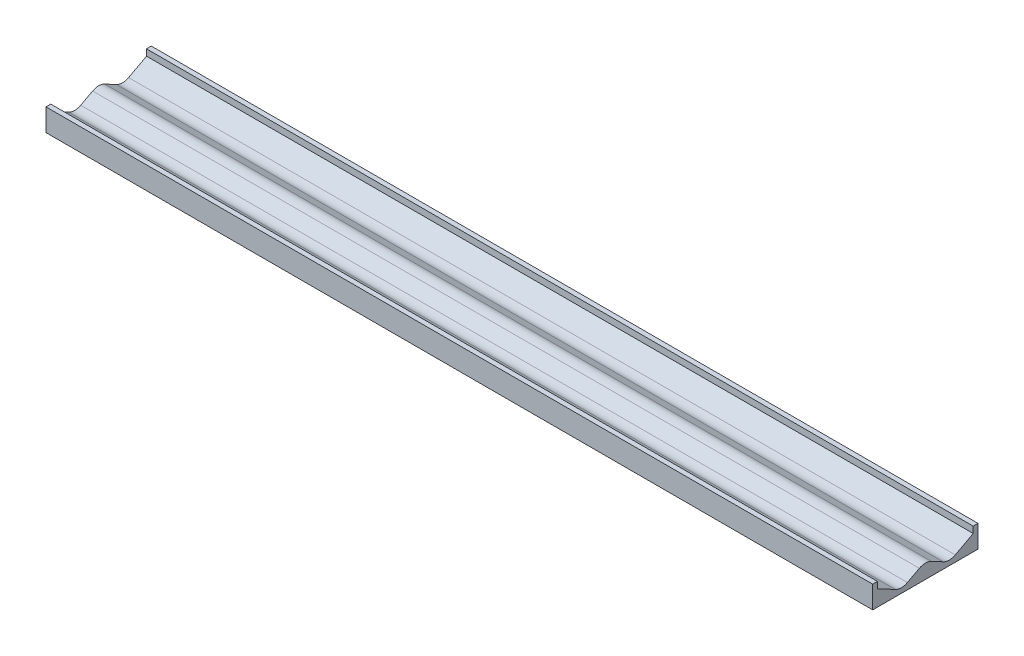
ISO-10303-21;
HEADER;
FILE_DESCRIPTION(('STEP AP214'),'2;1');
FILE_NAME('part.step','',(''),(''),'','','');
FILE_SCHEMA(('AUTOMOTIVE_DESIGN { 1 0 10303 214 1 1 1 1 }'));
ENDSEC;
DATA;
#1=APPLICATION_CONTEXT('core data for automotive mechanical design processes');
#2=APPLICATION_PROTOCOL_DEFINITION('international standard','automotive_design',2000,#1);
#3=PRODUCT_CONTEXT('',#1,'mechanical');
#4=PRODUCT('Part','Part','',(#3));
#5=PRODUCT_RELATED_PRODUCT_CATEGORY('part','',(#4));
#6=PRODUCT_DEFINITION_FORMATION('','',#4);
#7=PRODUCT_DEFINITION_CONTEXT('part definition',#1,'design');
#8=PRODUCT_DEFINITION('design','',#6,#7);
#9=PRODUCT_DEFINITION_SHAPE('','',#8);
#10=(LENGTH_UNIT() NAMED_UNIT(*) SI_UNIT(.MILLI.,.METRE.));
#11=(NAMED_UNIT(*) PLANE_ANGLE_UNIT() SI_UNIT($,.RADIAN.));
#12=(NAMED_UNIT(*) SI_UNIT($,.STERADIAN.) SOLID_ANGLE_UNIT());
#13=UNCERTAINTY_MEASURE_WITH_UNIT(LENGTH_MEASURE(1.E-05),#10,'distance_accuracy_value','');
#14=(GEOMETRIC_REPRESENTATION_CONTEXT(3) GLOBAL_UNCERTAINTY_ASSIGNED_CONTEXT((#13)) GLOBAL_UNIT_ASSIGNED_CONTEXT((#10,
#11,#12)) REPRESENTATION_CONTEXT('',''));
#15=CARTESIAN_POINT('',(0.,0.,0.));
#16=DIRECTION('',(0.,0.,1.));
#17=DIRECTION('',(1.,0.,0.));
#18=AXIS2_PLACEMENT_3D('',#15,#16,#17);
#19=CARTESIAN_POINT('',(0.,7.,0.));
#20=DIRECTION('',(0.,-1.,0.));
#21=DIRECTION('',(0.,0.,-1.));
#22=AXIS2_PLACEMENT_3D('',#19,#20,#21);
#23=PLANE('',#22);
#24=DIRECTION('',(0.,0.,-1.));
#25=VECTOR('',#24,1.);
#26=CARTESIAN_POINT('',(129.525,7.,16.5));
#27=LINE('',#26,#25);
#28=CARTESIAN_POINT('',(129.525,7.,16.5));
#29=VERTEX_POINT('',#28);
#30=CARTESIAN_POINT('',(129.525,7.,15.));
#31=VERTEX_POINT('',#30);
#32=EDGE_CURVE('E211',#29,#31,#27,.T.);
#33=ORIENTED_EDGE('',*,*,#32,.T.);
#34=DIRECTION('',(-1.,0.,0.));
#35=VECTOR('',#34,1.);
#36=CARTESIAN_POINT('',(0.,7.,15.));
#37=LINE('',#36,#35);
#38=CARTESIAN_POINT('',(-129.525,7.,15.));
#39=VERTEX_POINT('',#38);
#40=EDGE_CURVE('E239',#31,#39,#37,.T.);
#41=ORIENTED_EDGE('',*,*,#40,.T.);
#42=DIRECTION('',(0.,0.,1.));
#43=VECTOR('',#42,1.);
#44=CARTESIAN_POINT('',(-129.525,7.,16.5));
#45=LINE('',#44,#43);
#46=CARTESIAN_POINT('',(-129.525,7.,16.5));
#47=VERTEX_POINT('',#46);
#48=EDGE_CURVE('E215',#39,#47,#45,.T.);
#49=ORIENTED_EDGE('',*,*,#48,.T.);
#50=DIRECTION('',(1.,0.,0.));
#51=VECTOR('',#50,1.);
#52=CARTESIAN_POINT('',(-129.525,7.,16.5));
#53=LINE('',#52,#51);
#54=EDGE_CURVE('E57',#47,#29,#53,.T.);
#55=ORIENTED_EDGE('',*,*,#54,.T.);
#56=EDGE_LOOP('',(#33,#41,#49,#55));
#57=FACE_BOUND('',#56,.T.);
#58=ADVANCED_FACE('F33',(#57),#23,.F.);
#59=CARTESIAN_POINT('',(129.525,7.,16.5));
#60=DIRECTION('',(-1.,0.,0.));
#61=DIRECTION('',(0.,0.,1.));
#62=AXIS2_PLACEMENT_3D('',#59,#60,#61);
#63=PLANE('',#62);
#64=CARTESIAN_POINT('',(129.525,5.53333333333333,7.5));
#65=DIRECTION('',(1.,0.,0.));
#66=DIRECTION('',(0.,0.,1.));
#67=AXIS2_PLACEMENT_3D('',#64,#65,#66);
#68=CIRCLE('',#67,4.);
#69=CARTESIAN_POINT('',(129.525,2.00392156862746,9.38235294117648));
#70=VERTEX_POINT('',#69);
#71=CARTESIAN_POINT('',(129.525,2.00392156862746,5.61764705882351));
#72=VERTEX_POINT('',#71);
#73=EDGE_CURVE('E150',#70,#72,#68,.T.);
#74=ORIENTED_EDGE('',*,*,#73,.F.);
#75=DIRECTION('',(0.,-0.470588235294118,-0.88235294117647));
#76=VECTOR('',#75,1.);
#77=CARTESIAN_POINT('',(129.525,5.,15.));
#78=LINE('',#77,#76);
#79=CARTESIAN_POINT('',(129.525,5.,15.));
#80=VERTEX_POINT('',#79);
#81=EDGE_CURVE('E160',#80,#70,#78,.T.);
#82=ORIENTED_EDGE('',*,*,#81,.F.);
#83=DIRECTION('',(0.,-1.,0.));
#84=VECTOR('',#83,1.);
#85=CARTESIAN_POINT('',(129.525,7.,15.));
#86=LINE('',#85,#84);
#87=EDGE_CURVE('E199',#31,#80,#86,.T.);
#88=ORIENTED_EDGE('',*,*,#87,.F.);
#89=ORIENTED_EDGE('',*,*,#32,.F.);
#90=DIRECTION('',(0.,-1.,0.));
#91=VECTOR('',#90,1.);
#92=CARTESIAN_POINT('',(129.525,7.,16.5));
#93=LINE('',#92,#91);
#94=CARTESIAN_POINT('',(129.525,0.,16.5));
#95=VERTEX_POINT('',#94);
#96=EDGE_CURVE('E220',#29,#95,#93,.T.);
#97=ORIENTED_EDGE('',*,*,#96,.T.);
#98=DIRECTION('',(0.,0.,-1.));
#99=VECTOR('',#98,1.);
#100=CARTESIAN_POINT('',(129.525,0.,16.5));
#101=LINE('',#100,#99);
#102=CARTESIAN_POINT('',(129.525,0.,-16.5));
#103=VERTEX_POINT('',#102);
#104=EDGE_CURVE('E210',#95,#103,#101,.T.);
#105=ORIENTED_EDGE('',*,*,#104,.T.);
#106=DIRECTION('',(0.,-1.,0.));
#107=VECTOR('',#106,1.);
#108=CARTESIAN_POINT('',(129.525,7.,-16.5));
#109=LINE('',#108,#107);
#110=CARTESIAN_POINT('',(129.525,7.,-16.5));
#111=VERTEX_POINT('',#110);
#112=EDGE_CURVE('E234',#111,#103,#109,.T.);
#113=ORIENTED_EDGE('',*,*,#112,.F.);
#114=CARTESIAN_POINT('',(129.525,7.,-15.));
#115=VERTEX_POINT('',#114);
#116=EDGE_CURVE('E85',#115,#111,#27,.T.);
#117=ORIENTED_EDGE('',*,*,#116,.F.);
#118=DIRECTION('',(0.,1.,0.));
#119=VECTOR('',#118,1.);
#120=CARTESIAN_POINT('',(129.525,5.,-15.));
#121=LINE('',#120,#119);
#122=CARTESIAN_POINT('',(129.525,5.,-15.));
#123=VERTEX_POINT('',#122);
#124=EDGE_CURVE('E48',#123,#115,#121,.T.);
#125=ORIENTED_EDGE('',*,*,#124,.F.);
#126=DIRECTION('',(0.,0.470588235294117,-0.882352941176471));
#127=VECTOR('',#126,1.);
#128=CARTESIAN_POINT('',(129.525,2.00392156862746,-9.38235294117648));
#129=LINE('',#128,#127);
#130=CARTESIAN_POINT('',(129.525,2.00392156862746,-9.38235294117648));
#131=VERTEX_POINT('',#130);
#132=EDGE_CURVE('E157',#131,#123,#129,.T.);
#133=ORIENTED_EDGE('',*,*,#132,.F.);
#134=CARTESIAN_POINT('',(129.525,5.53333333333333,-7.5));
#135=DIRECTION('',(1.,0.,0.));
#136=DIRECTION('',(0.,0.,1.));
#137=AXIS2_PLACEMENT_3D('',#134,#135,#136);
#138=CIRCLE('',#137,4.);
#139=CARTESIAN_POINT('',(129.525,2.00392156862746,-5.61764705882351));
#140=VERTEX_POINT('',#139);
#141=EDGE_CURVE('E180',#140,#131,#138,.T.);
#142=ORIENTED_EDGE('',*,*,#141,.F.);
#143=DIRECTION('',(0.,-0.470588235294118,-0.88235294117647));
#144=VECTOR('',#143,1.);
#145=CARTESIAN_POINT('',(129.525,3.99607843137254,-1.88235294117649));
#146=LINE('',#145,#144);
#147=CARTESIAN_POINT('',(129.525,3.99607843137254,-1.88235294117649));
#148=VERTEX_POINT('',#147);
#149=EDGE_CURVE('E177',#148,#140,#146,.T.);
#150=ORIENTED_EDGE('',*,*,#149,.F.);
#151=CARTESIAN_POINT('',(129.525,0.466666666666666,0.));
#152=DIRECTION('',(-1.,0.,0.));
#153=DIRECTION('',(0.,0.,-1.));
#154=AXIS2_PLACEMENT_3D('',#151,#152,#153);
#155=CIRCLE('',#154,4.);
#156=CARTESIAN_POINT('',(129.525,3.99607843137254,1.88235294117648));
#157=VERTEX_POINT('',#156);
#158=EDGE_CURVE('E172',#157,#148,#155,.T.);
#159=ORIENTED_EDGE('',*,*,#158,.F.);
#160=DIRECTION('',(0.,0.470588235294118,-0.88235294117647));
#161=VECTOR('',#160,1.);
#162=CARTESIAN_POINT('',(129.525,2.00392156862746,5.61764705882351));
#163=LINE('',#162,#161);
#164=EDGE_CURVE('E170',#72,#157,#163,.T.);
#165=ORIENTED_EDGE('',*,*,#164,.F.);
#166=EDGE_LOOP('',(#74,#82,#88,#89,#97,#105,#113,#117,#125,#133,#142,#150,#159,#165));
#167=FACE_BOUND('',#166,.T.);
#168=ADVANCED_FACE('F35',(#167),#63,.F.);
#169=CARTESIAN_POINT('',(-129.525,7.,-16.5));
#170=DIRECTION('',(0.,0.,1.));
#171=DIRECTION('',(1.,0.,0.));
#172=AXIS2_PLACEMENT_3D('',#169,#170,#171);
#173=PLANE('',#172);
#174=DIRECTION('',(-1.,0.,0.));
#175=VECTOR('',#174,1.);
#176=CARTESIAN_POINT('',(-129.525,0.,-16.5));
#177=LINE('',#176,#175);
#178=CARTESIAN_POINT('',(-129.525,0.,-16.5));
#179=VERTEX_POINT('',#178);
#180=EDGE_CURVE('E223',#103,#179,#177,.T.);
#181=ORIENTED_EDGE('',*,*,#180,.T.);
#182=DIRECTION('',(0.,-1.,0.));
#183=VECTOR('',#182,1.);
#184=CARTESIAN_POINT('',(-129.525,7.,-16.5));
#185=LINE('',#184,#183);
#186=CARTESIAN_POINT('',(-129.525,7.,-16.5));
#187=VERTEX_POINT('',#186);
#188=EDGE_CURVE('E231',#187,#179,#185,.T.);
#189=ORIENTED_EDGE('',*,*,#188,.F.);
#190=DIRECTION('',(-1.,0.,0.));
#191=VECTOR('',#190,1.);
#192=CARTESIAN_POINT('',(-129.525,7.,-16.5));
#193=LINE('',#192,#191);
#194=EDGE_CURVE('E213',#111,#187,#193,.T.);
#195=ORIENTED_EDGE('',*,*,#194,.F.);
#196=ORIENTED_EDGE('',*,*,#112,.T.);
#197=EDGE_LOOP('',(#181,#189,#195,#196));
#198=FACE_BOUND('',#197,.T.);
#199=ADVANCED_FACE('F273',(#198),#173,.F.);
#200=CARTESIAN_POINT('',(-129.525,7.,16.5));
#201=DIRECTION('',(1.,0.,0.));
#202=DIRECTION('',(0.,0.,-1.));
#203=AXIS2_PLACEMENT_3D('',#200,#201,#202);
#204=PLANE('',#203);
#205=DIRECTION('',(0.,-1.,0.));
#206=VECTOR('',#205,1.);
#207=CARTESIAN_POINT('',(-129.525,7.,15.));
#208=LINE('',#207,#206);
#209=CARTESIAN_POINT('',(-129.525,5.,15.));
#210=VERTEX_POINT('',#209);
#211=EDGE_CURVE('E207',#39,#210,#208,.T.);
#212=ORIENTED_EDGE('',*,*,#211,.T.);
#213=DIRECTION('',(0.,-0.470588235294118,-0.882352941176471));
#214=VECTOR('',#213,1.);
#215=CARTESIAN_POINT('',(-129.525,6.06574394463668,16.9982698961938));
#216=LINE('',#215,#214);
#217=CARTESIAN_POINT('',(-129.525,2.00392156862746,9.38235294117648));
#218=VERTEX_POINT('',#217);
#219=EDGE_CURVE('E196',#210,#218,#216,.T.);
#220=ORIENTED_EDGE('',*,*,#219,.T.);
#221=CARTESIAN_POINT('',(-129.525,5.53333333333333,7.5));
#222=DIRECTION('',(1.,0.,0.));
#223=DIRECTION('',(0.,0.,-1.));
#224=AXIS2_PLACEMENT_3D('',#221,#222,#223);
#225=CIRCLE('',#224,4.);
#226=CARTESIAN_POINT('',(-129.525,2.00392156862746,5.61764705882351));
#227=VERTEX_POINT('',#226);
#228=EDGE_CURVE('E153',#218,#227,#225,.T.);
#229=ORIENTED_EDGE('',*,*,#228,.T.);
#230=DIRECTION('',(0.,0.470588235294117,-0.882352941176471));
#231=VECTOR('',#230,1.);
#232=CARTESIAN_POINT('',(-129.525,-1.40830449826989,12.0155709342561));
#233=LINE('',#232,#231);
#234=CARTESIAN_POINT('',(-129.525,3.99607843137254,1.88235294117648));
#235=VERTEX_POINT('',#234);
#236=EDGE_CURVE('E243',#227,#235,#233,.T.);
#237=ORIENTED_EDGE('',*,*,#236,.T.);
#238=CARTESIAN_POINT('',(-129.525,0.466666666666666,0.));
#239=DIRECTION('',(1.,0.,0.));
#240=DIRECTION('',(0.,0.,-1.));
#241=AXIS2_PLACEMENT_3D('',#238,#239,#240);
#242=CIRCLE('',#241,4.);
#243=CARTESIAN_POINT('',(-129.525,3.99607843137254,-1.88235294117649));
#244=VERTEX_POINT('',#243);
#245=EDGE_CURVE('E246',#235,#244,#242,.F.);
#246=ORIENTED_EDGE('',*,*,#245,.T.);
#247=DIRECTION('',(0.,-0.470588235294118,-0.882352941176471));
#248=VECTOR('',#247,1.);
#249=CARTESIAN_POINT('',(-129.525,12.2941176470588,13.6764705882353));
#250=LINE('',#249,#248);
#251=CARTESIAN_POINT('',(-129.525,2.00392156862746,-5.61764705882351));
#252=VERTEX_POINT('',#251);
#253=EDGE_CURVE('E41',#244,#252,#250,.T.);
#254=ORIENTED_EDGE('',*,*,#253,.T.);
#255=CARTESIAN_POINT('',(-129.525,5.53333333333333,-7.5));
#256=DIRECTION('',(1.,0.,0.));
#257=DIRECTION('',(0.,0.,-1.));
#258=AXIS2_PLACEMENT_3D('',#255,#256,#257);
#259=CIRCLE('',#258,4.);
#260=CARTESIAN_POINT('',(-129.525,2.00392156862746,-9.38235294117648));
#261=VERTEX_POINT('',#260);
#262=EDGE_CURVE('E11',#252,#261,#259,.T.);
#263=ORIENTED_EDGE('',*,*,#262,.T.);
#264=DIRECTION('',(0.,0.470588235294117,-0.882352941176471));
#265=VECTOR('',#264,1.);
#266=CARTESIAN_POINT('',(-129.525,-7.63667820069203,8.69377162629759));
#267=LINE('',#266,#265);
#268=CARTESIAN_POINT('',(-129.525,5.,-15.));
#269=VERTEX_POINT('',#268);
#270=EDGE_CURVE('E186',#261,#269,#267,.T.);
#271=ORIENTED_EDGE('',*,*,#270,.T.);
#272=DIRECTION('',(0.,1.,0.));
#273=VECTOR('',#272,1.);
#274=CARTESIAN_POINT('',(-129.525,7.00000000000003,-15.));
#275=LINE('',#274,#273);
#276=CARTESIAN_POINT('',(-129.525,7.,-15.));
#277=VERTEX_POINT('',#276);
#278=EDGE_CURVE('E203',#269,#277,#275,.T.);
#279=ORIENTED_EDGE('',*,*,#278,.T.);
#280=EDGE_CURVE('E216',#187,#277,#45,.T.);
#281=ORIENTED_EDGE('',*,*,#280,.F.);
#282=ORIENTED_EDGE('',*,*,#188,.T.);
#283=DIRECTION('',(0.,0.,1.));
#284=VECTOR('',#283,1.);
#285=CARTESIAN_POINT('',(-129.525,0.,16.5));
#286=LINE('',#285,#284);
#287=CARTESIAN_POINT('',(-129.525,0.,16.5));
#288=VERTEX_POINT('',#287);
#289=EDGE_CURVE('E225',#179,#288,#286,.T.);
#290=ORIENTED_EDGE('',*,*,#289,.T.);
#291=DIRECTION('',(0.,-1.,0.));
#292=VECTOR('',#291,1.);
#293=CARTESIAN_POINT('',(-129.525,7.,16.5));
#294=LINE('',#293,#292);
#295=EDGE_CURVE('E229',#47,#288,#294,.T.);
#296=ORIENTED_EDGE('',*,*,#295,.F.);
#297=ORIENTED_EDGE('',*,*,#48,.F.);
#298=EDGE_LOOP('',(#212,#220,#229,#237,#246,#254,#263,#271,#279,#281,#282,#290,#296,#297));
#299=FACE_BOUND('',#298,.T.);
#300=ADVANCED_FACE('F250',(#299),#204,.F.);
#301=CARTESIAN_POINT('',(-129.525,7.,16.5));
#302=DIRECTION('',(0.,0.,-1.));
#303=DIRECTION('',(-1.,0.,0.));
#304=AXIS2_PLACEMENT_3D('',#301,#302,#303);
#305=PLANE('',#304);
#306=DIRECTION('',(1.,0.,0.));
#307=VECTOR('',#306,1.);
#308=CARTESIAN_POINT('',(-129.525,0.,16.5));
#309=LINE('',#308,#307);
#310=EDGE_CURVE('E78',#288,#95,#309,.T.);
#311=ORIENTED_EDGE('',*,*,#310,.T.);
#312=ORIENTED_EDGE('',*,*,#96,.F.);
#313=ORIENTED_EDGE('',*,*,#54,.F.);
#314=ORIENTED_EDGE('',*,*,#295,.T.);
#315=EDGE_LOOP('',(#311,#312,#313,#314));
#316=FACE_BOUND('',#315,.T.);
#317=ADVANCED_FACE('F288',(#316),#305,.F.);
#318=ORIENTED_EDGE('',*,*,#280,.T.);
#319=DIRECTION('',(1.,0.,0.));
#320=VECTOR('',#319,1.);
#321=CARTESIAN_POINT('',(0.,7.,-15.));
#322=LINE('',#321,#320);
#323=EDGE_CURVE('E237',#277,#115,#322,.T.);
#324=ORIENTED_EDGE('',*,*,#323,.T.);
#325=ORIENTED_EDGE('',*,*,#116,.T.);
#326=ORIENTED_EDGE('',*,*,#194,.T.);
#327=EDGE_LOOP('',(#318,#324,#325,#326));
#328=FACE_BOUND('',#327,.T.);
#329=ADVANCED_FACE('F269',(#328),#23,.F.);
#330=CARTESIAN_POINT('',(0.,0.,0.));
#331=DIRECTION('',(0.,-1.,0.));
#332=DIRECTION('',(0.,0.,-1.));
#333=AXIS2_PLACEMENT_3D('',#330,#331,#332);
#334=PLANE('',#333);
#335=ORIENTED_EDGE('',*,*,#104,.F.);
#336=ORIENTED_EDGE('',*,*,#310,.F.);
#337=ORIENTED_EDGE('',*,*,#289,.F.);
#338=ORIENTED_EDGE('',*,*,#180,.F.);
#339=EDGE_LOOP('',(#335,#336,#337,#338));
#340=FACE_BOUND('',#339,.T.);
#341=ADVANCED_FACE('F278',(#340),#334,.T.);
#342=CARTESIAN_POINT('',(-161.475,7.,15.));
#343=DIRECTION('',(0.,0.,1.));
#344=DIRECTION('',(0.,-1.,0.));
#345=AXIS2_PLACEMENT_3D('',#342,#343,#344);
#346=PLANE('',#345);
#347=ORIENTED_EDGE('',*,*,#40,.F.);
#348=ORIENTED_EDGE('',*,*,#87,.T.);
#349=DIRECTION('',(1.,0.,0.));
#350=VECTOR('',#349,1.);
#351=CARTESIAN_POINT('',(-161.475,5.,15.));
#352=LINE('',#351,#350);
#353=EDGE_CURVE('E163',#210,#80,#352,.T.);
#354=ORIENTED_EDGE('',*,*,#353,.F.);
#355=ORIENTED_EDGE('',*,*,#211,.F.);
#356=EDGE_LOOP('',(#347,#348,#354,#355));
#357=FACE_BOUND('',#356,.T.);
#358=ADVANCED_FACE('F280',(#357),#346,.F.);
#359=CARTESIAN_POINT('',(-161.475,5.,-15.));
#360=DIRECTION('',(0.,0.,-1.));
#361=DIRECTION('',(0.,1.,0.));
#362=AXIS2_PLACEMENT_3D('',#359,#360,#361);
#363=PLANE('',#362);
#364=DIRECTION('',(1.,0.,0.));
#365=VECTOR('',#364,1.);
#366=CARTESIAN_POINT('',(-161.475,5.,-15.));
#367=LINE('',#366,#365);
#368=EDGE_CURVE('E201',#269,#123,#367,.T.);
#369=ORIENTED_EDGE('',*,*,#368,.T.);
#370=ORIENTED_EDGE('',*,*,#124,.T.);
#371=ORIENTED_EDGE('',*,*,#323,.F.);
#372=ORIENTED_EDGE('',*,*,#278,.F.);
#373=EDGE_LOOP('',(#369,#370,#371,#372));
#374=FACE_BOUND('',#373,.T.);
#375=ADVANCED_FACE('F268',(#374),#363,.F.);
#376=CARTESIAN_POINT('',(-161.475,5.53333333333333,-7.5));
#377=DIRECTION('',(1.,0.,0.));
#378=DIRECTION('',(0.,0.,-1.));
#379=AXIS2_PLACEMENT_3D('',#376,#377,#378);
#380=CYLINDRICAL_SURFACE('',#379,4.);
#381=DIRECTION('',(1.,0.,0.));
#382=VECTOR('',#381,1.);
#383=CARTESIAN_POINT('',(-161.475,2.00392156862746,-5.61764705882351));
#384=LINE('',#383,#382);
#385=EDGE_CURVE('E187',#252,#140,#384,.T.);
#386=ORIENTED_EDGE('',*,*,#385,.T.);
#387=ORIENTED_EDGE('',*,*,#141,.T.);
#388=DIRECTION('',(1.,0.,0.));
#389=VECTOR('',#388,1.);
#390=CARTESIAN_POINT('',(-161.475,2.00392156862746,-9.38235294117648));
#391=LINE('',#390,#389);
#392=EDGE_CURVE('E184',#261,#131,#391,.T.);
#393=ORIENTED_EDGE('',*,*,#392,.F.);
#394=ORIENTED_EDGE('',*,*,#262,.F.);
#395=EDGE_LOOP('',(#386,#387,#393,#394));
#396=FACE_BOUND('',#395,.T.);
#397=ADVANCED_FACE('F263',(#396),#380,.F.);
#398=CARTESIAN_POINT('',(-161.475,3.99607843137254,-1.88235294117649));
#399=DIRECTION('',(0.,-0.882352941176471,0.470588235294118));
#400=DIRECTION('',(0.,-0.470588235294118,-0.882352941176471));
#401=AXIS2_PLACEMENT_3D('',#398,#399,#400);
#402=PLANE('',#401);
#403=DIRECTION('',(1.,0.,0.));
#404=VECTOR('',#403,1.);
#405=CARTESIAN_POINT('',(-161.475,3.99607843137254,-1.88235294117649));
#406=LINE('',#405,#404);
#407=EDGE_CURVE('E189',#244,#148,#406,.T.);
#408=ORIENTED_EDGE('',*,*,#407,.T.);
#409=ORIENTED_EDGE('',*,*,#149,.T.);
#410=ORIENTED_EDGE('',*,*,#385,.F.);
#411=ORIENTED_EDGE('',*,*,#253,.F.);
#412=EDGE_LOOP('',(#408,#409,#410,#411));
#413=FACE_BOUND('',#412,.T.);
#414=ADVANCED_FACE('F254',(#413),#402,.F.);
#415=CARTESIAN_POINT('',(-161.475,0.466666666666666,0.));
#416=DIRECTION('',(1.,0.,0.));
#417=DIRECTION('',(0.,0.,-1.));
#418=AXIS2_PLACEMENT_3D('',#415,#416,#417);
#419=CYLINDRICAL_SURFACE('',#418,4.);
#420=DIRECTION('',(1.,0.,0.));
#421=VECTOR('',#420,1.);
#422=CARTESIAN_POINT('',(-161.475,3.99607843137254,1.88235294117648));
#423=LINE('',#422,#421);
#424=EDGE_CURVE('E191',#235,#157,#423,.T.);
#425=ORIENTED_EDGE('',*,*,#424,.T.);
#426=ORIENTED_EDGE('',*,*,#158,.T.);
#427=ORIENTED_EDGE('',*,*,#407,.F.);
#428=ORIENTED_EDGE('',*,*,#245,.F.);
#429=EDGE_LOOP('',(#425,#426,#427,#428));
#430=FACE_BOUND('',#429,.T.);
#431=ADVANCED_FACE('F256',(#430),#419,.T.);
#432=CARTESIAN_POINT('',(-161.475,2.00392156862746,5.61764705882351));
#433=DIRECTION('',(0.,-0.882352941176471,-0.470588235294118));
#434=DIRECTION('',(0.,0.470588235294117,-0.882352941176471));
#435=AXIS2_PLACEMENT_3D('',#432,#433,#434);
#436=PLANE('',#435);
#437=DIRECTION('',(1.,0.,0.));
#438=VECTOR('',#437,1.);
#439=CARTESIAN_POINT('',(-161.475,2.00392156862746,5.61764705882351));
#440=LINE('',#439,#438);
#441=EDGE_CURVE('E156',#227,#72,#440,.T.);
#442=ORIENTED_EDGE('',*,*,#441,.T.);
#443=ORIENTED_EDGE('',*,*,#164,.T.);
#444=ORIENTED_EDGE('',*,*,#424,.F.);
#445=ORIENTED_EDGE('',*,*,#236,.F.);
#446=EDGE_LOOP('',(#442,#443,#444,#445));
#447=FACE_BOUND('',#446,.T.);
#448=ADVANCED_FACE('F302',(#447),#436,.F.);
#449=CARTESIAN_POINT('',(-161.475,5.53333333333333,7.5));
#450=DIRECTION('',(1.,0.,0.));
#451=DIRECTION('',(0.,0.,-1.));
#452=AXIS2_PLACEMENT_3D('',#449,#450,#451);
#453=CYLINDRICAL_SURFACE('',#452,4.);
#454=DIRECTION('',(1.,0.,0.));
#455=VECTOR('',#454,1.);
#456=CARTESIAN_POINT('',(-161.475,2.00392156862746,9.38235294117648));
#457=LINE('',#456,#455);
#458=EDGE_CURVE('E145',#218,#70,#457,.T.);
#459=ORIENTED_EDGE('',*,*,#458,.T.);
#460=ORIENTED_EDGE('',*,*,#73,.T.);
#461=ORIENTED_EDGE('',*,*,#441,.F.);
#462=ORIENTED_EDGE('',*,*,#228,.F.);
#463=EDGE_LOOP('',(#459,#460,#461,#462));
#464=FACE_BOUND('',#463,.T.);
#465=ADVANCED_FACE('F147',(#464),#453,.F.);
#466=CARTESIAN_POINT('',(-161.475,5.,15.));
#467=DIRECTION('',(0.,-0.882352941176471,0.470588235294118));
#468=DIRECTION('',(0.,-0.470588235294118,-0.882352941176471));
#469=AXIS2_PLACEMENT_3D('',#466,#467,#468);
#470=PLANE('',#469);
#471=ORIENTED_EDGE('',*,*,#353,.T.);
#472=ORIENTED_EDGE('',*,*,#81,.T.);
#473=ORIENTED_EDGE('',*,*,#458,.F.);
#474=ORIENTED_EDGE('',*,*,#219,.F.);
#475=EDGE_LOOP('',(#471,#472,#473,#474));
#476=FACE_BOUND('',#475,.T.);
#477=ADVANCED_FACE('F161',(#476),#470,.F.);
#478=CARTESIAN_POINT('',(-161.475,2.00392156862746,-9.38235294117648));
#479=DIRECTION('',(0.,-0.882352941176471,-0.470588235294117));
#480=DIRECTION('',(0.,0.470588235294117,-0.882352941176471));
#481=AXIS2_PLACEMENT_3D('',#478,#479,#480);
#482=PLANE('',#481);
#483=ORIENTED_EDGE('',*,*,#392,.T.);
#484=ORIENTED_EDGE('',*,*,#132,.T.);
#485=ORIENTED_EDGE('',*,*,#368,.F.);
#486=ORIENTED_EDGE('',*,*,#270,.F.);
#487=EDGE_LOOP('',(#483,#484,#485,#486));
#488=FACE_BOUND('',#487,.T.);
#489=ADVANCED_FACE('F265',(#488),#482,.F.);
#490=CLOSED_SHELL('',(#58,#168,#199,#300,#317,#329,#341,#358,#375,#397,#414,#431,#448,#465,#477,#489));
#491=MANIFOLD_SOLID_BREP('B2',#490);
#492=ADVANCED_BREP_SHAPE_REPRESENTATION('',(#18,#491),#14);
#493=SHAPE_DEFINITION_REPRESENTATION(#9,#492);
ENDSEC;
END-ISO-10303-21;
